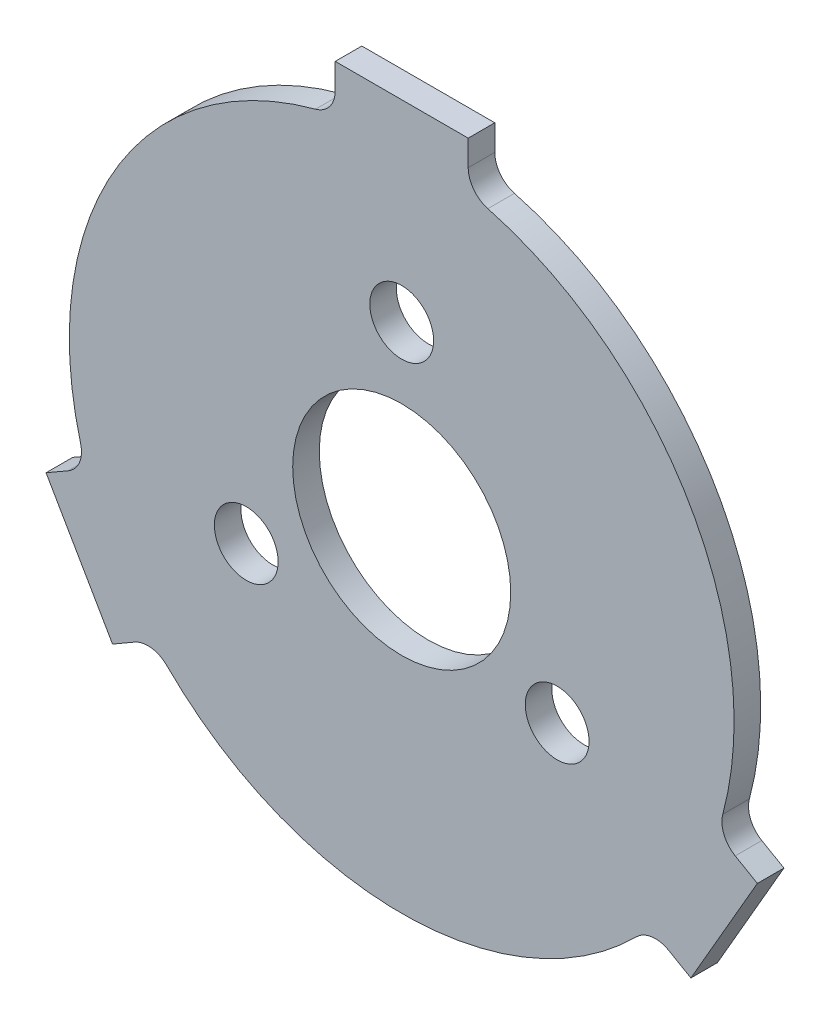
ISO-10303-21;
HEADER;
FILE_DESCRIPTION(('STEP AP214'),'2;1');
FILE_NAME('part.step','',(''),(''),'','','');
FILE_SCHEMA(('AUTOMOTIVE_DESIGN { 1 0 10303 214 1 1 1 1 }'));
ENDSEC;
DATA;
#1=APPLICATION_CONTEXT('core data for automotive mechanical design processes');
#2=APPLICATION_PROTOCOL_DEFINITION('international standard','automotive_design',2000,#1);
#3=PRODUCT_CONTEXT('',#1,'mechanical');
#4=PRODUCT('Part','Part','',(#3));
#5=PRODUCT_RELATED_PRODUCT_CATEGORY('part','',(#4));
#6=PRODUCT_DEFINITION_FORMATION('','',#4);
#7=PRODUCT_DEFINITION_CONTEXT('part definition',#1,'design');
#8=PRODUCT_DEFINITION('design','',#6,#7);
#9=PRODUCT_DEFINITION_SHAPE('','',#8);
#10=(LENGTH_UNIT() NAMED_UNIT(*) SI_UNIT(.MILLI.,.METRE.));
#11=(NAMED_UNIT(*) PLANE_ANGLE_UNIT() SI_UNIT($,.RADIAN.));
#12=(NAMED_UNIT(*) SI_UNIT($,.STERADIAN.) SOLID_ANGLE_UNIT());
#13=UNCERTAINTY_MEASURE_WITH_UNIT(LENGTH_MEASURE(1.E-05),#10,'distance_accuracy_value','');
#14=(GEOMETRIC_REPRESENTATION_CONTEXT(3) GLOBAL_UNCERTAINTY_ASSIGNED_CONTEXT((#13)) GLOBAL_UNIT_ASSIGNED_CONTEXT((#10,
#11,#12)) REPRESENTATION_CONTEXT('',''));
#15=CARTESIAN_POINT('',(0.,0.,0.));
#16=DIRECTION('',(0.,0.,1.));
#17=DIRECTION('',(1.,0.,0.));
#18=AXIS2_PLACEMENT_3D('',#15,#16,#17);
#19=CARTESIAN_POINT('',(-2.5,13.7499625000001,-23.4500125));
#20=DIRECTION('',(0.,-1.,0.));
#21=DIRECTION('',(1.,0.,0.));
#22=AXIS2_PLACEMENT_3D('',#19,#20,#21);
#23=PLANE('',#22);
#24=DIRECTION('',(-1.,0.,0.));
#25=VECTOR('',#24,1.);
#26=CARTESIAN_POINT('',(0.,13.7499625,-1.25001249999995));
#27=LINE('',#26,#25);
#28=CARTESIAN_POINT('',(2.5,13.7499625,-1.25001249999995));
#29=VERTEX_POINT('',#28);
#30=CARTESIAN_POINT('',(-2.5,13.7499625,-1.25001249999995));
#31=VERTEX_POINT('',#30);
#32=EDGE_CURVE('E249',#29,#31,#27,.T.);
#33=ORIENTED_EDGE('',*,*,#32,.T.);
#34=DIRECTION('',(0.,0.,-1.));
#35=VECTOR('',#34,1.);
#36=CARTESIAN_POINT('',(-2.5,13.7499625,-0.250012499999953));
#37=LINE('',#36,#35);
#38=CARTESIAN_POINT('',(-2.5,13.7499625,-0.250012499999953));
#39=VERTEX_POINT('',#38);
#40=EDGE_CURVE('E243',#39,#31,#37,.T.);
#41=ORIENTED_EDGE('',*,*,#40,.F.);
#42=DIRECTION('',(1.,0.,0.));
#43=VECTOR('',#42,1.);
#44=CARTESIAN_POINT('',(0.,13.7499625,-0.250012499999953));
#45=LINE('',#44,#43);
#46=CARTESIAN_POINT('',(2.5,13.7499625,-0.250012499999953));
#47=VERTEX_POINT('',#46);
#48=EDGE_CURVE('E240',#39,#47,#45,.T.);
#49=ORIENTED_EDGE('',*,*,#48,.T.);
#50=DIRECTION('',(0.,0.,1.));
#51=VECTOR('',#50,1.);
#52=CARTESIAN_POINT('',(2.5,13.7499625,-0.250012499999953));
#53=LINE('',#52,#51);
#54=EDGE_CURVE('E254',#29,#47,#53,.T.);
#55=ORIENTED_EDGE('',*,*,#54,.F.);
#56=EDGE_LOOP('',(#33,#41,#49,#55));
#57=FACE_BOUND('',#56,.T.);
#58=ADVANCED_FACE('F34',(#57),#23,.F.);
#59=CARTESIAN_POINT('',(-10.8743556529822,-9.41510100946106,-1.25001250000003));
#60=DIRECTION('',(0.866025403784417,0.500000000000037,0.));
#61=DIRECTION('',(-0.500000000000037,0.866025403784417,0.));
#62=AXIS2_PLACEMENT_3D('',#59,#60,#61);
#63=PLANE('',#62);
#64=DIRECTION('',(0.500000000000037,-0.866025403784417,0.));
#65=VECTOR('',#64,1.);
#66=CARTESIAN_POINT('',(-12.1243556529819,-7.25003750000057,-1.25001250000003));
#67=LINE('',#66,#65);
#68=CARTESIAN_POINT('',(-13.3743556529823,-5.08497399053897,-1.25001250000002));
#69=VERTEX_POINT('',#68);
#70=CARTESIAN_POINT('',(-10.8743556529822,-9.41510100946106,-1.25001250000003));
#71=VERTEX_POINT('',#70);
#72=EDGE_CURVE('E181',#69,#71,#67,.T.);
#73=ORIENTED_EDGE('',*,*,#72,.T.);
#74=DIRECTION('',(0.,0.,-1.));
#75=VECTOR('',#74,1.);
#76=CARTESIAN_POINT('',(-10.8743556529822,-9.41510100946107,-0.250012500000034));
#77=LINE('',#76,#75);
#78=CARTESIAN_POINT('',(-10.8743556529822,-9.41510100946107,-0.250012500000034));
#79=VERTEX_POINT('',#78);
#80=EDGE_CURVE('E174',#79,#71,#77,.T.);
#81=ORIENTED_EDGE('',*,*,#80,.F.);
#82=DIRECTION('',(-0.500000000000037,0.866025403784417,0.));
#83=VECTOR('',#82,1.);
#84=CARTESIAN_POINT('',(-12.1243556529819,-7.25003750000058,-0.250012500000026));
#85=LINE('',#84,#83);
#86=CARTESIAN_POINT('',(-13.3743556529823,-5.08497399053898,-0.250012500000018));
#87=VERTEX_POINT('',#86);
#88=EDGE_CURVE('E251',#79,#87,#85,.T.);
#89=ORIENTED_EDGE('',*,*,#88,.T.);
#90=DIRECTION('',(0.,0.,1.));
#91=VECTOR('',#90,1.);
#92=CARTESIAN_POINT('',(-13.3743556529823,-5.08497399053898,-0.250012500000018));
#93=LINE('',#92,#91);
#94=EDGE_CURVE('E256',#69,#87,#93,.T.);
#95=ORIENTED_EDGE('',*,*,#94,.F.);
#96=EDGE_LOOP('',(#73,#81,#89,#95));
#97=FACE_BOUND('',#96,.T.);
#98=ADVANCED_FACE('F279',(#97),#63,.F.);
#99=CARTESIAN_POINT('',(13.3743556529821,-5.08497399053892,-1.25001250000002));
#100=DIRECTION('',(-0.86602540378445,0.499999999999981,0.));
#101=DIRECTION('',(-0.499999999999981,-0.86602540378445,0.));
#102=AXIS2_PLACEMENT_3D('',#99,#100,#101);
#103=PLANE('',#102);
#104=DIRECTION('',(0.499999999999981,0.86602540378445,0.));
#105=VECTOR('',#104,1.);
#106=CARTESIAN_POINT('',(12.1243556529823,-7.25003749999976,-1.25001250000003));
#107=LINE('',#106,#105);
#108=CARTESIAN_POINT('',(10.8743556529822,-9.41510100946117,-1.25001250000003));
#109=VERTEX_POINT('',#108);
#110=CARTESIAN_POINT('',(13.3743556529821,-5.08497399053892,-1.25001250000002));
#111=VERTEX_POINT('',#110);
#112=EDGE_CURVE('E38',#109,#111,#107,.T.);
#113=ORIENTED_EDGE('',*,*,#112,.T.);
#114=DIRECTION('',(0.,0.,-1.));
#115=VECTOR('',#114,1.);
#116=CARTESIAN_POINT('',(13.3743556529821,-5.08497399053892,-0.250012500000018));
#117=LINE('',#116,#115);
#118=CARTESIAN_POINT('',(13.3743556529821,-5.08497399053892,-0.250012500000018));
#119=VERTEX_POINT('',#118);
#120=EDGE_CURVE('E173',#119,#111,#117,.T.);
#121=ORIENTED_EDGE('',*,*,#120,.F.);
#122=DIRECTION('',(-0.499999999999981,-0.86602540378445,0.));
#123=VECTOR('',#122,1.);
#124=CARTESIAN_POINT('',(12.1243556529823,-7.25003749999976,-0.250012500000026));
#125=LINE('',#124,#123);
#126=CARTESIAN_POINT('',(10.8743556529822,-9.41510100946117,-0.250012500000034));
#127=VERTEX_POINT('',#126);
#128=EDGE_CURVE('E168',#119,#127,#125,.T.);
#129=ORIENTED_EDGE('',*,*,#128,.T.);
#130=DIRECTION('',(0.,0.,1.));
#131=VECTOR('',#130,1.);
#132=CARTESIAN_POINT('',(10.8743556529822,-9.41510100946117,-0.250012500000034));
#133=LINE('',#132,#131);
#134=EDGE_CURVE('E163',#109,#127,#133,.T.);
#135=ORIENTED_EDGE('',*,*,#134,.F.);
#136=EDGE_LOOP('',(#113,#121,#129,#135));
#137=FACE_BOUND('',#136,.T.);
#138=ADVANCED_FACE('F165',(#137),#103,.F.);
#139=CARTESIAN_POINT('',(0.,-0.2500375,-0.250012500000001));
#140=DIRECTION('',(0.,0.,1.));
#141=DIRECTION('',(0.,-1.,0.));
#142=AXIS2_PLACEMENT_3D('',#139,#140,#141);
#143=PLANE('',#142);
#144=ORIENTED_EDGE('',*,*,#48,.F.);
#145=DIRECTION('',(0.,-1.,0.));
#146=VECTOR('',#145,1.);
#147=CARTESIAN_POINT('',(-2.5,14.7499625,-0.250012499999949));
#148=LINE('',#147,#146);
#149=CARTESIAN_POINT('',(-2.5,12.7883673104053,-0.250012499999956));
#150=VERTEX_POINT('',#149);
#151=EDGE_CURVE('E221',#39,#150,#148,.T.);
#152=ORIENTED_EDGE('',*,*,#151,.T.);
#153=CARTESIAN_POINT('',(-3.5,12.7883673104053,-0.250012499999956));
#154=DIRECTION('',(0.,0.,1.));
#155=DIRECTION('',(0.,-1.,0.));
#156=AXIS2_PLACEMENT_3D('',#153,#154,#155);
#157=CIRCLE('',#156,1.);
#158=CARTESIAN_POINT('',(-3.24074074074074,11.8225595466716,-0.250012499999959));
#159=VERTEX_POINT('',#158);
#160=EDGE_CURVE('E330',#150,#159,#157,.F.);
#161=ORIENTED_EDGE('',*,*,#160,.T.);
#162=CARTESIAN_POINT('',(0.,-0.2500375,-0.250012500000001));
#163=DIRECTION('',(0.,0.,1.));
#164=DIRECTION('',(0.,-1.,0.));
#165=AXIS2_PLACEMENT_3D('',#162,#163,#164);
#166=CIRCLE('',#165,12.5);
#167=CARTESIAN_POINT('',(-12.075546102441,-3.47977221477503,-0.250012500000013));
#168=VERTEX_POINT('',#167);
#169=EDGE_CURVE('E275',#159,#168,#166,.T.);
#170=ORIENTED_EDGE('',*,*,#169,.T.);
#171=CARTESIAN_POINT('',(-13.0415897906362,-3.73815099195703,-0.250012500000014));
#172=DIRECTION('',(0.,0.,1.));
#173=DIRECTION('',(0.,-1.,0.));
#174=AXIS2_PLACEMENT_3D('',#171,#172,#173);
#175=CIRCLE('',#174,1.);
#176=CARTESIAN_POINT('',(-12.5415897906362,-4.60417639574145,-0.250012500000017));
#177=VERTEX_POINT('',#176);
#178=EDGE_CURVE('E342',#168,#177,#175,.F.);
#179=ORIENTED_EDGE('',*,*,#178,.T.);
#180=DIRECTION('',(-0.866025403784418,-0.500000000000035,0.));
#181=VECTOR('',#180,1.);
#182=CARTESIAN_POINT('',(-14.2403810567666,-5.5849739905389,-0.25001250000002));
#183=LINE('',#182,#181);
#184=EDGE_CURVE('E273',#177,#87,#183,.T.);
#185=ORIENTED_EDGE('',*,*,#184,.T.);
#186=ORIENTED_EDGE('',*,*,#88,.F.);
#187=DIRECTION('',(0.866025403784417,0.500000000000037,0.));
#188=VECTOR('',#187,1.);
#189=CARTESIAN_POINT('',(-11.7403810567666,-9.9151010094611,-0.250012500000035));
#190=LINE('',#189,#188);
#191=CARTESIAN_POINT('',(-10.0415897906363,-8.93430341466371,-0.250012500000032));
#192=VERTEX_POINT('',#191);
#193=EDGE_CURVE('E271',#79,#192,#190,.T.);
#194=ORIENTED_EDGE('',*,*,#193,.T.);
#195=CARTESIAN_POINT('',(-9.54158979063627,-9.80032881844813,-0.250012500000035));
#196=DIRECTION('',(0.,0.,1.));
#197=DIRECTION('',(0.,-1.,0.));
#198=AXIS2_PLACEMENT_3D('',#195,#196,#197);
#199=CIRCLE('',#198,1.);
#200=CARTESIAN_POINT('',(-8.83480536170025,-9.09289983189641,-0.250012500000032));
#201=VERTEX_POINT('',#200);
#202=EDGE_CURVE('E258',#192,#201,#199,.F.);
#203=ORIENTED_EDGE('',*,*,#202,.T.);
#204=CARTESIAN_POINT('',(0.,-0.2500375,-0.250012500000001));
#205=DIRECTION('',(0.,0.,1.));
#206=DIRECTION('',(0.,-1.,0.));
#207=AXIS2_PLACEMENT_3D('',#204,#205,#206);
#208=CIRCLE('',#207,12.5);
#209=CARTESIAN_POINT('',(8.83480536170017,-9.0928998318965,-0.250012500000032));
#210=VERTEX_POINT('',#209);
#211=EDGE_CURVE('E274',#201,#210,#208,.T.);
#212=ORIENTED_EDGE('',*,*,#211,.T.);
#213=CARTESIAN_POINT('',(9.54158979063619,-9.80032881844822,-0.250012500000035));
#214=DIRECTION('',(0.,0.,1.));
#215=DIRECTION('',(0.,-1.,0.));
#216=AXIS2_PLACEMENT_3D('',#213,#214,#215);
#217=CIRCLE('',#216,1.);
#218=CARTESIAN_POINT('',(10.0415897906362,-8.93430341466377,-0.250012500000032));
#219=VERTEX_POINT('',#218);
#220=EDGE_CURVE('E436',#210,#219,#217,.F.);
#221=ORIENTED_EDGE('',*,*,#220,.T.);
#222=DIRECTION('',(0.86602540378445,-0.499999999999981,0.));
#223=VECTOR('',#222,1.);
#224=CARTESIAN_POINT('',(11.7403810567666,-9.91510100946109,-0.250012500000035));
#225=LINE('',#224,#223);
#226=EDGE_CURVE('E262',#219,#127,#225,.T.);
#227=ORIENTED_EDGE('',*,*,#226,.T.);
#228=ORIENTED_EDGE('',*,*,#128,.F.);
#229=DIRECTION('',(-0.86602540378445,0.49999999999998,0.));
#230=VECTOR('',#229,1.);
#231=CARTESIAN_POINT('',(14.2403810567666,-5.5849739905389,-0.25001250000002));
#232=LINE('',#231,#230);
#233=CARTESIAN_POINT('',(12.5415897906362,-4.6041763957416,-0.250012500000017));
#234=VERTEX_POINT('',#233);
#235=EDGE_CURVE('E236',#119,#234,#232,.T.);
#236=ORIENTED_EDGE('',*,*,#235,.T.);
#237=CARTESIAN_POINT('',(13.0415897906362,-3.73815099195716,-0.250012500000014));
#238=DIRECTION('',(0.,0.,1.));
#239=DIRECTION('',(0.,-1.,0.));
#240=AXIS2_PLACEMENT_3D('',#237,#238,#239);
#241=CIRCLE('',#240,1.);
#242=CARTESIAN_POINT('',(12.0755461024409,-3.47977221477514,-0.250012500000013));
#243=VERTEX_POINT('',#242);
#244=EDGE_CURVE('E298',#234,#243,#241,.F.);
#245=ORIENTED_EDGE('',*,*,#244,.T.);
#246=CARTESIAN_POINT('',(0.,-0.2500375,-0.250012500000001));
#247=DIRECTION('',(0.,0.,1.));
#248=DIRECTION('',(0.,-1.,0.));
#249=AXIS2_PLACEMENT_3D('',#246,#247,#248);
#250=CIRCLE('',#249,12.5);
#251=CARTESIAN_POINT('',(3.24074074074074,11.8225595466716,-0.250012499999959));
#252=VERTEX_POINT('',#251);
#253=EDGE_CURVE('E206',#243,#252,#250,.T.);
#254=ORIENTED_EDGE('',*,*,#253,.T.);
#255=CARTESIAN_POINT('',(3.5,12.7883673104053,-0.250012499999956));
#256=DIRECTION('',(0.,0.,1.));
#257=DIRECTION('',(0.,-1.,0.));
#258=AXIS2_PLACEMENT_3D('',#255,#256,#257);
#259=CIRCLE('',#258,1.);
#260=CARTESIAN_POINT('',(2.5,12.7883673104053,-0.250012499999956));
#261=VERTEX_POINT('',#260);
#262=EDGE_CURVE('E340',#252,#261,#259,.F.);
#263=ORIENTED_EDGE('',*,*,#262,.T.);
#264=DIRECTION('',(0.,1.,0.));
#265=VECTOR('',#264,1.);
#266=CARTESIAN_POINT('',(2.5,14.7499625,-0.250012499999949));
#267=LINE('',#266,#265);
#268=EDGE_CURVE('E229',#261,#47,#267,.T.);
#269=ORIENTED_EDGE('',*,*,#268,.T.);
#270=EDGE_LOOP('',(#144,#152,#161,#170,#179,#185,#186,#194,#203,#212,#221,#227,#228,#236,#245,
#254,#263,#269));
#271=FACE_BOUND('',#270,.T.);
#272=CARTESIAN_POINT('',(5.84567147554496,-3.6250375,-0.250012500000013));
#273=DIRECTION('',(0.,0.,1.));
#274=DIRECTION('',(0.,-1.,0.));
#275=AXIS2_PLACEMENT_3D('',#272,#273,#274);
#276=CIRCLE('',#275,1.2);
#277=CARTESIAN_POINT('',(5.84567147554496,-4.8250375,-0.250012500000017));
#278=VERTEX_POINT('',#277);
#279=EDGE_CURVE('E456',#278,#278,#276,.T.);
#280=ORIENTED_EDGE('',*,*,#279,.F.);
#281=EDGE_LOOP('',(#280));
#282=FACE_BOUND('',#281,.T.);
#283=CARTESIAN_POINT('',(0.,-0.2500375,-0.250012500000001));
#284=DIRECTION('',(0.,0.,1.));
#285=DIRECTION('',(0.,-1.,0.));
#286=AXIS2_PLACEMENT_3D('',#283,#284,#285);
#287=CIRCLE('',#286,4.1);
#288=CARTESIAN_POINT('',(0.,-4.3500375,-0.250012500000016));
#289=VERTEX_POINT('',#288);
#290=EDGE_CURVE('E212',#289,#289,#287,.T.);
#291=ORIENTED_EDGE('',*,*,#290,.F.);
#292=EDGE_LOOP('',(#291));
#293=FACE_BOUND('',#292,.T.);
#294=CARTESIAN_POINT('',(0.,6.4999625,-0.250012499999978));
#295=DIRECTION('',(0.,0.,1.));
#296=DIRECTION('',(0.,-1.,0.));
#297=AXIS2_PLACEMENT_3D('',#294,#295,#296);
#298=CIRCLE('',#297,1.2);
#299=CARTESIAN_POINT('',(0.,5.2999625,-0.250012499999982));
#300=VERTEX_POINT('',#299);
#301=EDGE_CURVE('E450',#300,#300,#298,.T.);
#302=ORIENTED_EDGE('',*,*,#301,.F.);
#303=EDGE_LOOP('',(#302));
#304=FACE_BOUND('',#303,.T.);
#305=CARTESIAN_POINT('',(-5.84567147554496,-3.6250375,-0.250012500000013));
#306=DIRECTION('',(0.,0.,1.));
#307=DIRECTION('',(0.,-1.,0.));
#308=AXIS2_PLACEMENT_3D('',#305,#306,#307);
#309=CIRCLE('',#308,1.2);
#310=CARTESIAN_POINT('',(-5.84567147554496,-4.8250375,-0.250012500000017));
#311=VERTEX_POINT('',#310);
#312=EDGE_CURVE('E43',#311,#311,#309,.T.);
#313=ORIENTED_EDGE('',*,*,#312,.F.);
#314=EDGE_LOOP('',(#313));
#315=FACE_BOUND('',#314,.T.);
#316=ADVANCED_FACE('F327',(#271,#282,#293,#304,#315),#143,.T.);
#317=CARTESIAN_POINT('',(14.2403810567666,-5.5849739905389,-0.25001250000002));
#318=DIRECTION('',(-0.49999999999998,-0.86602540378445,0.));
#319=DIRECTION('',(0.86602540378445,-0.49999999999998,0.));
#320=AXIS2_PLACEMENT_3D('',#317,#318,#319);
#321=PLANE('',#320);
#322=ORIENTED_EDGE('',*,*,#235,.F.);
#323=ORIENTED_EDGE('',*,*,#120,.T.);
#324=DIRECTION('',(-0.86602540378445,0.49999999999998,0.));
#325=VECTOR('',#324,1.);
#326=CARTESIAN_POINT('',(14.2403810567666,-5.5849739905389,-1.25001250000002));
#327=LINE('',#326,#325);
#328=CARTESIAN_POINT('',(12.5415897906362,-4.6041763957416,-1.25001250000002));
#329=VERTEX_POINT('',#328);
#330=EDGE_CURVE('E180',#111,#329,#327,.T.);
#331=ORIENTED_EDGE('',*,*,#330,.T.);
#332=DIRECTION('',(0.,0.,1.));
#333=VECTOR('',#332,1.);
#334=CARTESIAN_POINT('',(12.5415897906362,-4.6041763957416,-0.250012500000017));
#335=LINE('',#334,#333);
#336=EDGE_CURVE('E224',#329,#234,#335,.T.);
#337=ORIENTED_EDGE('',*,*,#336,.T.);
#338=EDGE_LOOP('',(#322,#323,#331,#337));
#339=FACE_BOUND('',#338,.T.);
#340=ADVANCED_FACE('F352',(#339),#321,.F.);
#341=CARTESIAN_POINT('',(13.0415897906362,-3.73815099195716,-0.250012500000014));
#342=DIRECTION('',(0.,0.,-1.));
#343=DIRECTION('',(0.,1.,0.));
#344=AXIS2_PLACEMENT_3D('',#341,#342,#343);
#345=CYLINDRICAL_SURFACE('',#344,1.);
#346=ORIENTED_EDGE('',*,*,#244,.F.);
#347=ORIENTED_EDGE('',*,*,#336,.F.);
#348=CARTESIAN_POINT('',(13.0415897906362,-3.73815099195715,-1.25001250000001));
#349=DIRECTION('',(0.,0.,1.));
#350=DIRECTION('',(0.,-1.,0.));
#351=AXIS2_PLACEMENT_3D('',#348,#349,#350);
#352=CIRCLE('',#351,1.);
#353=CARTESIAN_POINT('',(12.0755461024409,-3.47977221477514,-1.25001250000001));
#354=VERTEX_POINT('',#353);
#355=EDGE_CURVE('E51',#354,#329,#352,.T.);
#356=ORIENTED_EDGE('',*,*,#355,.F.);
#357=DIRECTION('',(0.,0.,-1.));
#358=VECTOR('',#357,1.);
#359=CARTESIAN_POINT('',(12.0755461024409,-3.47977221477514,-0.250012500000013));
#360=LINE('',#359,#358);
#361=EDGE_CURVE('E226',#243,#354,#360,.T.);
#362=ORIENTED_EDGE('',*,*,#361,.F.);
#363=EDGE_LOOP('',(#346,#347,#356,#362));
#364=FACE_BOUND('',#363,.T.);
#365=ADVANCED_FACE('F350',(#364),#345,.F.);
#366=CARTESIAN_POINT('',(0.,-0.2500375,-0.250012500000001));
#367=DIRECTION('',(0.,0.,-1.));
#368=DIRECTION('',(0.,1.,0.));
#369=AXIS2_PLACEMENT_3D('',#366,#367,#368);
#370=CYLINDRICAL_SURFACE('',#369,12.5);
#371=ORIENTED_EDGE('',*,*,#253,.F.);
#372=ORIENTED_EDGE('',*,*,#361,.T.);
#373=CARTESIAN_POINT('',(0.,-0.250037499999997,-1.2500125));
#374=DIRECTION('',(0.,0.,1.));
#375=DIRECTION('',(0.,-1.,0.));
#376=AXIS2_PLACEMENT_3D('',#373,#374,#375);
#377=CIRCLE('',#376,12.5);
#378=CARTESIAN_POINT('',(3.24074074074074,11.8225595466716,-1.25001249999996));
#379=VERTEX_POINT('',#378);
#380=EDGE_CURVE('E191',#354,#379,#377,.T.);
#381=ORIENTED_EDGE('',*,*,#380,.T.);
#382=DIRECTION('',(0.,0.,-1.));
#383=VECTOR('',#382,1.);
#384=CARTESIAN_POINT('',(3.24074074074074,11.8225595466716,-0.250012499999959));
#385=LINE('',#384,#383);
#386=EDGE_CURVE('E213',#379,#252,#385,.F.);
#387=ORIENTED_EDGE('',*,*,#386,.T.);
#388=EDGE_LOOP('',(#371,#372,#381,#387));
#389=FACE_BOUND('',#388,.T.);
#390=ADVANCED_FACE('F349',(#389),#370,.T.);
#391=CARTESIAN_POINT('',(3.5,12.7883673104053,-0.250012499999956));
#392=DIRECTION('',(0.,0.,-1.));
#393=DIRECTION('',(0.,1.,0.));
#394=AXIS2_PLACEMENT_3D('',#391,#392,#393);
#395=CYLINDRICAL_SURFACE('',#394,1.);
#396=ORIENTED_EDGE('',*,*,#262,.F.);
#397=ORIENTED_EDGE('',*,*,#386,.F.);
#398=CARTESIAN_POINT('',(3.5,12.7883673104053,-1.25001249999996));
#399=DIRECTION('',(0.,0.,1.));
#400=DIRECTION('',(0.,-1.,0.));
#401=AXIS2_PLACEMENT_3D('',#398,#399,#400);
#402=CIRCLE('',#401,1.);
#403=CARTESIAN_POINT('',(2.5,12.7883673104053,-1.25001249999996));
#404=VERTEX_POINT('',#403);
#405=EDGE_CURVE('E59',#404,#379,#402,.T.);
#406=ORIENTED_EDGE('',*,*,#405,.F.);
#407=DIRECTION('',(0.,0.,1.));
#408=VECTOR('',#407,1.);
#409=CARTESIAN_POINT('',(2.5,12.7883673104053,-1.25001249999996));
#410=LINE('',#409,#408);
#411=EDGE_CURVE('E222',#261,#404,#410,.F.);
#412=ORIENTED_EDGE('',*,*,#411,.F.);
#413=EDGE_LOOP('',(#396,#397,#406,#412));
#414=FACE_BOUND('',#413,.T.);
#415=ADVANCED_FACE('F358',(#414),#395,.F.);
#416=CARTESIAN_POINT('',(2.5,14.7499625,-0.250012499999949));
#417=DIRECTION('',(-1.,0.,0.));
#418=DIRECTION('',(0.,-1.,0.));
#419=AXIS2_PLACEMENT_3D('',#416,#417,#418);
#420=PLANE('',#419);
#421=DIRECTION('',(0.,1.,0.));
#422=VECTOR('',#421,1.);
#423=CARTESIAN_POINT('',(2.5,14.7499625,-1.25001249999995));
#424=LINE('',#423,#422);
#425=EDGE_CURVE('E217',#404,#29,#424,.T.);
#426=ORIENTED_EDGE('',*,*,#425,.T.);
#427=ORIENTED_EDGE('',*,*,#54,.T.);
#428=ORIENTED_EDGE('',*,*,#268,.F.);
#429=ORIENTED_EDGE('',*,*,#411,.T.);
#430=EDGE_LOOP('',(#426,#427,#428,#429));
#431=FACE_BOUND('',#430,.T.);
#432=ADVANCED_FACE('F36',(#431),#420,.F.);
#433=CARTESIAN_POINT('',(-2.5,14.7499625,-0.250012499999949));
#434=DIRECTION('',(1.,0.,0.));
#435=DIRECTION('',(0.,1.,0.));
#436=AXIS2_PLACEMENT_3D('',#433,#434,#435);
#437=PLANE('',#436);
#438=ORIENTED_EDGE('',*,*,#151,.F.);
#439=ORIENTED_EDGE('',*,*,#40,.T.);
#440=DIRECTION('',(0.,-1.,0.));
#441=VECTOR('',#440,1.);
#442=CARTESIAN_POINT('',(-2.5,14.7499625,-1.25001249999995));
#443=LINE('',#442,#441);
#444=CARTESIAN_POINT('',(-2.5,12.7883673104053,-1.25001249999996));
#445=VERTEX_POINT('',#444);
#446=EDGE_CURVE('E203',#31,#445,#443,.T.);
#447=ORIENTED_EDGE('',*,*,#446,.T.);
#448=DIRECTION('',(0.,0.,1.));
#449=VECTOR('',#448,1.);
#450=CARTESIAN_POINT('',(-2.5,12.7883673104053,-0.250012499999956));
#451=LINE('',#450,#449);
#452=EDGE_CURVE('E307',#445,#150,#451,.T.);
#453=ORIENTED_EDGE('',*,*,#452,.T.);
#454=EDGE_LOOP('',(#438,#439,#447,#453));
#455=FACE_BOUND('',#454,.T.);
#456=ADVANCED_FACE('F333',(#455),#437,.F.);
#457=CARTESIAN_POINT('',(-3.5,12.7883673104053,-0.250012499999956));
#458=DIRECTION('',(0.,0.,-1.));
#459=DIRECTION('',(0.,1.,0.));
#460=AXIS2_PLACEMENT_3D('',#457,#458,#459);
#461=CYLINDRICAL_SURFACE('',#460,1.);
#462=ORIENTED_EDGE('',*,*,#160,.F.);
#463=ORIENTED_EDGE('',*,*,#452,.F.);
#464=CARTESIAN_POINT('',(-3.5,12.7883673104053,-1.25001249999996));
#465=DIRECTION('',(0.,0.,1.));
#466=DIRECTION('',(0.,-1.,0.));
#467=AXIS2_PLACEMENT_3D('',#464,#465,#466);
#468=CIRCLE('',#467,1.);
#469=CARTESIAN_POINT('',(-3.24074074074074,11.8225595466716,-1.25001249999996));
#470=VERTEX_POINT('',#469);
#471=EDGE_CURVE('E337',#470,#445,#468,.T.);
#472=ORIENTED_EDGE('',*,*,#471,.F.);
#473=DIRECTION('',(0.,0.,-1.));
#474=VECTOR('',#473,1.);
#475=CARTESIAN_POINT('',(-3.24074074074074,11.8225595466716,-0.250012499999959));
#476=LINE('',#475,#474);
#477=EDGE_CURVE('E310',#159,#470,#476,.T.);
#478=ORIENTED_EDGE('',*,*,#477,.F.);
#479=EDGE_LOOP('',(#462,#463,#472,#478));
#480=FACE_BOUND('',#479,.T.);
#481=ADVANCED_FACE('F336',(#480),#461,.F.);
#482=CARTESIAN_POINT('',(0.,-0.2500375,-0.250012500000001));
#483=DIRECTION('',(0.,0.,-1.));
#484=DIRECTION('',(0.,1.,0.));
#485=AXIS2_PLACEMENT_3D('',#482,#483,#484);
#486=CYLINDRICAL_SURFACE('',#485,12.5);
#487=ORIENTED_EDGE('',*,*,#169,.F.);
#488=ORIENTED_EDGE('',*,*,#477,.T.);
#489=CARTESIAN_POINT('',(0.,-0.250037499999997,-1.2500125));
#490=DIRECTION('',(0.,0.,1.));
#491=DIRECTION('',(0.,-1.,0.));
#492=AXIS2_PLACEMENT_3D('',#489,#490,#491);
#493=CIRCLE('',#492,12.5);
#494=CARTESIAN_POINT('',(-12.075546102441,-3.47977221477503,-1.25001250000001));
#495=VERTEX_POINT('',#494);
#496=EDGE_CURVE('E200',#470,#495,#493,.T.);
#497=ORIENTED_EDGE('',*,*,#496,.T.);
#498=DIRECTION('',(0.,0.,-1.));
#499=VECTOR('',#498,1.);
#500=CARTESIAN_POINT('',(-12.075546102441,-3.47977221477503,-0.250012500000013));
#501=LINE('',#500,#499);
#502=EDGE_CURVE('E312',#495,#168,#501,.F.);
#503=ORIENTED_EDGE('',*,*,#502,.T.);
#504=EDGE_LOOP('',(#487,#488,#497,#503));
#505=FACE_BOUND('',#504,.T.);
#506=ADVANCED_FACE('F380',(#505),#486,.T.);
#507=CARTESIAN_POINT('',(-13.0415897906362,-3.73815099195703,-0.250012500000014));
#508=DIRECTION('',(0.,0.,-1.));
#509=DIRECTION('',(0.,1.,0.));
#510=AXIS2_PLACEMENT_3D('',#507,#508,#509);
#511=CYLINDRICAL_SURFACE('',#510,1.);
#512=ORIENTED_EDGE('',*,*,#178,.F.);
#513=ORIENTED_EDGE('',*,*,#502,.F.);
#514=CARTESIAN_POINT('',(-13.0415897906362,-3.73815099195703,-1.25001250000001));
#515=DIRECTION('',(0.,0.,1.));
#516=DIRECTION('',(0.,-1.,0.));
#517=AXIS2_PLACEMENT_3D('',#514,#515,#516);
#518=CIRCLE('',#517,1.);
#519=CARTESIAN_POINT('',(-12.5415897906362,-4.60417639574145,-1.25001250000002));
#520=VERTEX_POINT('',#519);
#521=EDGE_CURVE('E338',#520,#495,#518,.T.);
#522=ORIENTED_EDGE('',*,*,#521,.F.);
#523=DIRECTION('',(0.,0.,1.));
#524=VECTOR('',#523,1.);
#525=CARTESIAN_POINT('',(-12.5415897906362,-4.60417639574145,-1.25001250000002));
#526=LINE('',#525,#524);
#527=EDGE_CURVE('E304',#177,#520,#526,.F.);
#528=ORIENTED_EDGE('',*,*,#527,.F.);
#529=EDGE_LOOP('',(#512,#513,#522,#528));
#530=FACE_BOUND('',#529,.T.);
#531=ADVANCED_FACE('F388',(#530),#511,.F.);
#532=CARTESIAN_POINT('',(-14.2403810567666,-5.5849739905389,-0.25001250000002));
#533=DIRECTION('',(0.500000000000035,-0.866025403784418,0.));
#534=DIRECTION('',(0.866025403784419,0.500000000000035,0.));
#535=AXIS2_PLACEMENT_3D('',#532,#533,#534);
#536=PLANE('',#535);
#537=DIRECTION('',(-0.866025403784418,-0.500000000000035,0.));
#538=VECTOR('',#537,1.);
#539=CARTESIAN_POINT('',(-14.2403810567666,-5.5849739905389,-1.25001250000002));
#540=LINE('',#539,#538);
#541=EDGE_CURVE('E197',#520,#69,#540,.T.);
#542=ORIENTED_EDGE('',*,*,#541,.T.);
#543=ORIENTED_EDGE('',*,*,#94,.T.);
#544=ORIENTED_EDGE('',*,*,#184,.F.);
#545=ORIENTED_EDGE('',*,*,#527,.T.);
#546=EDGE_LOOP('',(#542,#543,#544,#545));
#547=FACE_BOUND('',#546,.T.);
#548=ADVANCED_FACE('F372',(#547),#536,.F.);
#549=CARTESIAN_POINT('',(-11.7403810567666,-9.9151010094611,-0.250012500000035));
#550=DIRECTION('',(-0.500000000000037,0.866025403784417,0.));
#551=DIRECTION('',(-0.866025403784417,-0.500000000000037,0.));
#552=AXIS2_PLACEMENT_3D('',#549,#550,#551);
#553=PLANE('',#552);
#554=ORIENTED_EDGE('',*,*,#193,.F.);
#555=ORIENTED_EDGE('',*,*,#80,.T.);
#556=DIRECTION('',(0.866025403784417,0.500000000000037,0.));
#557=VECTOR('',#556,1.);
#558=CARTESIAN_POINT('',(-11.7403810567666,-9.9151010094611,-1.25001250000004));
#559=LINE('',#558,#557);
#560=CARTESIAN_POINT('',(-10.0415897906363,-8.93430341466371,-1.25001250000003));
#561=VERTEX_POINT('',#560);
#562=EDGE_CURVE('E189',#71,#561,#559,.T.);
#563=ORIENTED_EDGE('',*,*,#562,.T.);
#564=DIRECTION('',(0.,0.,1.));
#565=VECTOR('',#564,1.);
#566=CARTESIAN_POINT('',(-10.0415897906363,-8.93430341466371,-0.250012500000032));
#567=LINE('',#566,#565);
#568=EDGE_CURVE('E288',#561,#192,#567,.T.);
#569=ORIENTED_EDGE('',*,*,#568,.T.);
#570=EDGE_LOOP('',(#554,#555,#563,#569));
#571=FACE_BOUND('',#570,.T.);
#572=ADVANCED_FACE('F287',(#571),#553,.F.);
#573=CARTESIAN_POINT('',(-9.54158979063627,-9.80032881844813,-0.250012500000035));
#574=DIRECTION('',(0.,0.,-1.));
#575=DIRECTION('',(0.,1.,0.));
#576=AXIS2_PLACEMENT_3D('',#573,#574,#575);
#577=CYLINDRICAL_SURFACE('',#576,1.);
#578=ORIENTED_EDGE('',*,*,#202,.F.);
#579=ORIENTED_EDGE('',*,*,#568,.F.);
#580=CARTESIAN_POINT('',(-9.54158979063627,-9.80032881844813,-1.25001250000003));
#581=DIRECTION('',(0.,0.,1.));
#582=DIRECTION('',(0.,-1.,0.));
#583=AXIS2_PLACEMENT_3D('',#580,#581,#582);
#584=CIRCLE('',#583,1.);
#585=CARTESIAN_POINT('',(-8.83480536170025,-9.09289983189641,-1.25001250000003));
#586=VERTEX_POINT('',#585);
#587=EDGE_CURVE('E283',#586,#561,#584,.T.);
#588=ORIENTED_EDGE('',*,*,#587,.F.);
#589=DIRECTION('',(0.,0.,-1.));
#590=VECTOR('',#589,1.);
#591=CARTESIAN_POINT('',(-8.83480536170025,-9.09289983189641,-0.250012500000032));
#592=LINE('',#591,#590);
#593=EDGE_CURVE('E296',#201,#586,#592,.T.);
#594=ORIENTED_EDGE('',*,*,#593,.F.);
#595=EDGE_LOOP('',(#578,#579,#588,#594));
#596=FACE_BOUND('',#595,.T.);
#597=ADVANCED_FACE('F291',(#596),#577,.F.);
#598=CARTESIAN_POINT('',(0.,-0.2500375,-0.250012500000001));
#599=DIRECTION('',(0.,0.,-1.));
#600=DIRECTION('',(0.,1.,0.));
#601=AXIS2_PLACEMENT_3D('',#598,#599,#600);
#602=CYLINDRICAL_SURFACE('',#601,12.5);
#603=CARTESIAN_POINT('',(0.,-0.250037499999997,-1.2500125));
#604=DIRECTION('',(0.,0.,1.));
#605=DIRECTION('',(0.,-1.,0.));
#606=AXIS2_PLACEMENT_3D('',#603,#604,#605);
#607=CIRCLE('',#606,12.5);
#608=CARTESIAN_POINT('',(8.83480536170017,-9.09289983189649,-1.25001250000003));
#609=VERTEX_POINT('',#608);
#610=EDGE_CURVE('E186',#586,#609,#607,.T.);
#611=ORIENTED_EDGE('',*,*,#610,.T.);
#612=DIRECTION('',(0.,0.,-1.));
#613=VECTOR('',#612,1.);
#614=CARTESIAN_POINT('',(8.83480536170017,-9.09289983189649,-0.250012500000032));
#615=LINE('',#614,#613);
#616=EDGE_CURVE('E294',#609,#210,#615,.F.);
#617=ORIENTED_EDGE('',*,*,#616,.T.);
#618=ORIENTED_EDGE('',*,*,#211,.F.);
#619=ORIENTED_EDGE('',*,*,#593,.T.);
#620=EDGE_LOOP('',(#611,#617,#618,#619));
#621=FACE_BOUND('',#620,.T.);
#622=ADVANCED_FACE('F395',(#621),#602,.T.);
#623=CARTESIAN_POINT('',(9.54158979063619,-9.80032881844822,-0.250012500000035));
#624=DIRECTION('',(0.,0.,-1.));
#625=DIRECTION('',(0.,1.,0.));
#626=AXIS2_PLACEMENT_3D('',#623,#624,#625);
#627=CYLINDRICAL_SURFACE('',#626,1.);
#628=ORIENTED_EDGE('',*,*,#220,.F.);
#629=ORIENTED_EDGE('',*,*,#616,.F.);
#630=CARTESIAN_POINT('',(9.54158979063619,-9.80032881844821,-1.25001250000003));
#631=DIRECTION('',(0.,0.,1.));
#632=DIRECTION('',(0.,-1.,0.));
#633=AXIS2_PLACEMENT_3D('',#630,#631,#632);
#634=CIRCLE('',#633,1.);
#635=CARTESIAN_POINT('',(10.0415897906362,-8.93430341466376,-1.25001250000003));
#636=VERTEX_POINT('',#635);
#637=EDGE_CURVE('E435',#636,#609,#634,.T.);
#638=ORIENTED_EDGE('',*,*,#637,.F.);
#639=DIRECTION('',(0.,0.,1.));
#640=VECTOR('',#639,1.);
#641=CARTESIAN_POINT('',(10.0415897906362,-8.93430341466376,-1.25001250000003));
#642=LINE('',#641,#640);
#643=EDGE_CURVE('E185',#219,#636,#642,.F.);
#644=ORIENTED_EDGE('',*,*,#643,.F.);
#645=EDGE_LOOP('',(#628,#629,#638,#644));
#646=FACE_BOUND('',#645,.T.);
#647=ADVANCED_FACE('F392',(#646),#627,.F.);
#648=CARTESIAN_POINT('',(11.7403810567666,-9.91510100946109,-0.250012500000035));
#649=DIRECTION('',(0.499999999999981,0.86602540378445,0.));
#650=DIRECTION('',(-0.86602540378445,0.499999999999981,0.));
#651=AXIS2_PLACEMENT_3D('',#648,#649,#650);
#652=PLANE('',#651);
#653=DIRECTION('',(0.86602540378445,-0.499999999999981,0.));
#654=VECTOR('',#653,1.);
#655=CARTESIAN_POINT('',(11.7403810567666,-9.91510100946109,-1.25001250000004));
#656=LINE('',#655,#654);
#657=EDGE_CURVE('E178',#636,#109,#656,.T.);
#658=ORIENTED_EDGE('',*,*,#657,.T.);
#659=ORIENTED_EDGE('',*,*,#134,.T.);
#660=ORIENTED_EDGE('',*,*,#226,.F.);
#661=ORIENTED_EDGE('',*,*,#643,.T.);
#662=EDGE_LOOP('',(#658,#659,#660,#661));
#663=FACE_BOUND('',#662,.T.);
#664=ADVANCED_FACE('F183',(#663),#652,.F.);
#665=CARTESIAN_POINT('',(5.84567147554496,-3.6250375,-0.250012500000013));
#666=DIRECTION('',(0.,0.,-1.));
#667=DIRECTION('',(0.,1.,0.));
#668=AXIS2_PLACEMENT_3D('',#665,#666,#667);
#669=CYLINDRICAL_SURFACE('',#668,1.2);
#670=ORIENTED_EDGE('',*,*,#279,.T.);
#671=EDGE_LOOP('',(#670));
#672=FACE_BOUND('',#671,.T.);
#673=CARTESIAN_POINT('',(5.84567147554496,-3.6250375,-1.25001250000001));
#674=DIRECTION('',(0.,0.,1.));
#675=DIRECTION('',(0.,-1.,0.));
#676=AXIS2_PLACEMENT_3D('',#673,#674,#675);
#677=CIRCLE('',#676,1.2);
#678=CARTESIAN_POINT('',(5.84567147554496,-4.8250375,-1.25001250000002));
#679=VERTEX_POINT('',#678);
#680=EDGE_CURVE('E459',#679,#679,#677,.T.);
#681=ORIENTED_EDGE('',*,*,#680,.F.);
#682=EDGE_LOOP('',(#681));
#683=FACE_BOUND('',#682,.T.);
#684=ADVANCED_FACE('F417',(#672,#683),#669,.F.);
#685=CARTESIAN_POINT('',(0.,-0.2500375,-0.250012500000001));
#686=DIRECTION('',(0.,0.,-1.));
#687=DIRECTION('',(0.,1.,0.));
#688=AXIS2_PLACEMENT_3D('',#685,#686,#687);
#689=CYLINDRICAL_SURFACE('',#688,4.1);
#690=ORIENTED_EDGE('',*,*,#290,.T.);
#691=EDGE_LOOP('',(#690));
#692=FACE_BOUND('',#691,.T.);
#693=CARTESIAN_POINT('',(0.,-0.250037499999997,-1.2500125));
#694=DIRECTION('',(0.,0.,1.));
#695=DIRECTION('',(0.,-1.,0.));
#696=AXIS2_PLACEMENT_3D('',#693,#694,#695);
#697=CIRCLE('',#696,4.1);
#698=CARTESIAN_POINT('',(0.,-4.3500375,-1.25001250000002));
#699=VERTEX_POINT('',#698);
#700=EDGE_CURVE('E447',#699,#699,#697,.T.);
#701=ORIENTED_EDGE('',*,*,#700,.F.);
#702=EDGE_LOOP('',(#701));
#703=FACE_BOUND('',#702,.T.);
#704=ADVANCED_FACE('F414',(#692,#703),#689,.F.);
#705=CARTESIAN_POINT('',(0.,6.4999625,-0.250012499999978));
#706=DIRECTION('',(0.,0.,-1.));
#707=DIRECTION('',(0.,1.,0.));
#708=AXIS2_PLACEMENT_3D('',#705,#706,#707);
#709=CYLINDRICAL_SURFACE('',#708,1.2);
#710=ORIENTED_EDGE('',*,*,#301,.T.);
#711=EDGE_LOOP('',(#710));
#712=FACE_BOUND('',#711,.T.);
#713=CARTESIAN_POINT('',(0.,6.4999625,-1.25001249999998));
#714=DIRECTION('',(0.,0.,1.));
#715=DIRECTION('',(0.,-1.,0.));
#716=AXIS2_PLACEMENT_3D('',#713,#714,#715);
#717=CIRCLE('',#716,1.2);
#718=CARTESIAN_POINT('',(0.,5.2999625,-1.25001249999998));
#719=VERTEX_POINT('',#718);
#720=EDGE_CURVE('E453',#719,#719,#717,.T.);
#721=ORIENTED_EDGE('',*,*,#720,.F.);
#722=EDGE_LOOP('',(#721));
#723=FACE_BOUND('',#722,.T.);
#724=ADVANCED_FACE('F409',(#712,#723),#709,.F.);
#725=CARTESIAN_POINT('',(-5.84567147554496,-3.6250375,-0.250012500000013));
#726=DIRECTION('',(0.,0.,-1.));
#727=DIRECTION('',(0.,1.,0.));
#728=AXIS2_PLACEMENT_3D('',#725,#726,#727);
#729=CYLINDRICAL_SURFACE('',#728,1.2);
#730=ORIENTED_EDGE('',*,*,#312,.T.);
#731=EDGE_LOOP('',(#730));
#732=FACE_BOUND('',#731,.T.);
#733=CARTESIAN_POINT('',(-5.84567147554496,-3.6250375,-1.25001250000001));
#734=DIRECTION('',(0.,0.,1.));
#735=DIRECTION('',(0.,-1.,0.));
#736=AXIS2_PLACEMENT_3D('',#733,#734,#735);
#737=CIRCLE('',#736,1.2);
#738=CARTESIAN_POINT('',(-5.84567147554496,-4.8250375,-1.25001250000002));
#739=VERTEX_POINT('',#738);
#740=EDGE_CURVE('E11',#739,#739,#737,.T.);
#741=ORIENTED_EDGE('',*,*,#740,.F.);
#742=EDGE_LOOP('',(#741));
#743=FACE_BOUND('',#742,.T.);
#744=ADVANCED_FACE('F403',(#732,#743),#729,.F.);
#745=CARTESIAN_POINT('',(0.,-0.250037499999997,-1.2500125));
#746=DIRECTION('',(0.,0.,1.));
#747=DIRECTION('',(0.,-1.,0.));
#748=AXIS2_PLACEMENT_3D('',#745,#746,#747);
#749=PLANE('',#748);
#750=ORIENTED_EDGE('',*,*,#740,.T.);
#751=EDGE_LOOP('',(#750));
#752=FACE_BOUND('',#751,.T.);
#753=ORIENTED_EDGE('',*,*,#720,.T.);
#754=EDGE_LOOP('',(#753));
#755=FACE_BOUND('',#754,.T.);
#756=ORIENTED_EDGE('',*,*,#700,.T.);
#757=EDGE_LOOP('',(#756));
#758=FACE_BOUND('',#757,.T.);
#759=ORIENTED_EDGE('',*,*,#680,.T.);
#760=EDGE_LOOP('',(#759));
#761=FACE_BOUND('',#760,.T.);
#762=ORIENTED_EDGE('',*,*,#112,.F.);
#763=ORIENTED_EDGE('',*,*,#657,.F.);
#764=ORIENTED_EDGE('',*,*,#637,.T.);
#765=ORIENTED_EDGE('',*,*,#610,.F.);
#766=ORIENTED_EDGE('',*,*,#587,.T.);
#767=ORIENTED_EDGE('',*,*,#562,.F.);
#768=ORIENTED_EDGE('',*,*,#72,.F.);
#769=ORIENTED_EDGE('',*,*,#541,.F.);
#770=ORIENTED_EDGE('',*,*,#521,.T.);
#771=ORIENTED_EDGE('',*,*,#496,.F.);
#772=ORIENTED_EDGE('',*,*,#471,.T.);
#773=ORIENTED_EDGE('',*,*,#446,.F.);
#774=ORIENTED_EDGE('',*,*,#32,.F.);
#775=ORIENTED_EDGE('',*,*,#425,.F.);
#776=ORIENTED_EDGE('',*,*,#405,.T.);
#777=ORIENTED_EDGE('',*,*,#380,.F.);
#778=ORIENTED_EDGE('',*,*,#355,.T.);
#779=ORIENTED_EDGE('',*,*,#330,.F.);
#780=EDGE_LOOP('',(#762,#763,#764,#765,#766,#767,#768,#769,#770,#771,#772,#773,#774,#775,#776,
#777,#778,#779));
#781=FACE_BOUND('',#780,.T.);
#782=ADVANCED_FACE('F177',(#752,#755,#758,#761,#781),#749,.F.);
#783=CLOSED_SHELL('',(#58,#98,#138,#316,#340,#365,#390,#415,#432,#456,#481,#506,#531,#548,#572,
#597,#622,#647,#664,#684,#704,#724,#744,#782));
#784=MANIFOLD_SOLID_BREP('B2',#783);
#785=ADVANCED_BREP_SHAPE_REPRESENTATION('',(#18,#784),#14);
#786=SHAPE_DEFINITION_REPRESENTATION(#9,#785);
ENDSEC;
END-ISO-10303-21;
